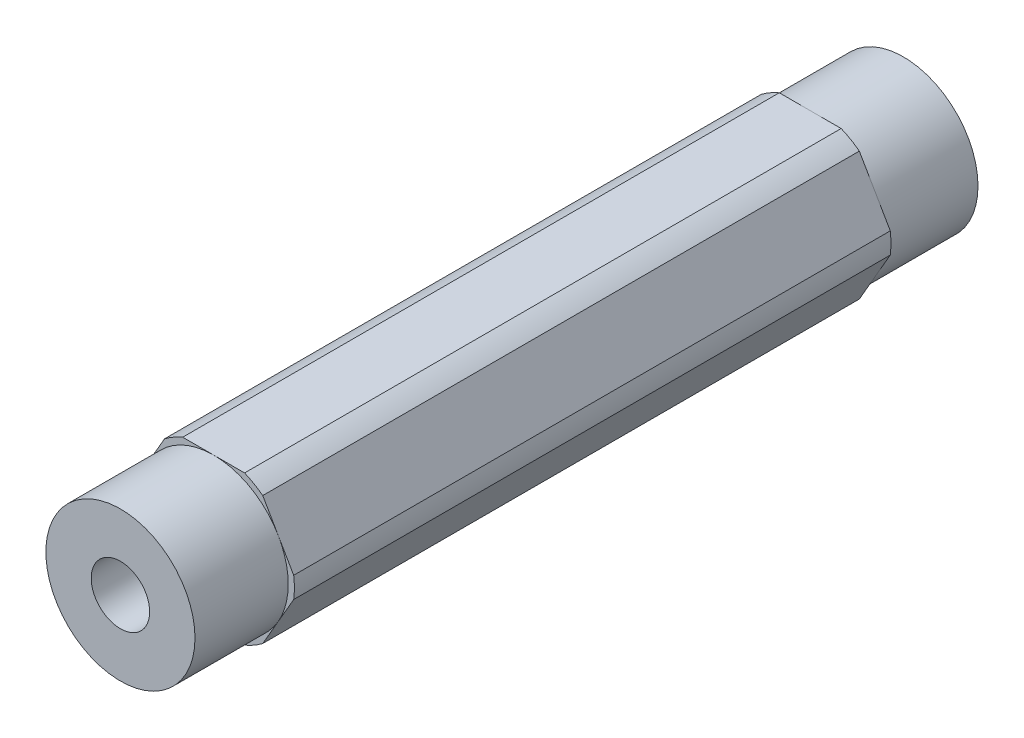
ISO-10303-21;
HEADER;
FILE_DESCRIPTION(('STEP AP214'),'2;1');
FILE_NAME('part.step','',(''),(''),'','','');
FILE_SCHEMA(('AUTOMOTIVE_DESIGN { 1 0 10303 214 1 1 1 1 }'));
ENDSEC;
DATA;
#1=APPLICATION_CONTEXT('core data for automotive mechanical design processes');
#2=APPLICATION_PROTOCOL_DEFINITION('international standard','automotive_design',2000,#1);
#3=PRODUCT_CONTEXT('',#1,'mechanical');
#4=PRODUCT('Part','Part','',(#3));
#5=PRODUCT_RELATED_PRODUCT_CATEGORY('part','',(#4));
#6=PRODUCT_DEFINITION_FORMATION('','',#4);
#7=PRODUCT_DEFINITION_CONTEXT('part definition',#1,'design');
#8=PRODUCT_DEFINITION('design','',#6,#7);
#9=PRODUCT_DEFINITION_SHAPE('','',#8);
#10=(LENGTH_UNIT() NAMED_UNIT(*) SI_UNIT(.MILLI.,.METRE.));
#11=(NAMED_UNIT(*) PLANE_ANGLE_UNIT() SI_UNIT($,.RADIAN.));
#12=(NAMED_UNIT(*) SI_UNIT($,.STERADIAN.) SOLID_ANGLE_UNIT());
#13=UNCERTAINTY_MEASURE_WITH_UNIT(LENGTH_MEASURE(1.E-05),#10,'distance_accuracy_value','');
#14=(GEOMETRIC_REPRESENTATION_CONTEXT(3) GLOBAL_UNCERTAINTY_ASSIGNED_CONTEXT((#13)) GLOBAL_UNIT_ASSIGNED_CONTEXT((#10,
#11,#12)) REPRESENTATION_CONTEXT('',''));
#15=CARTESIAN_POINT('',(0.,0.,0.));
#16=DIRECTION('',(0.,0.,1.));
#17=DIRECTION('',(1.,0.,0.));
#18=AXIS2_PLACEMENT_3D('',#15,#16,#17);
#19=CARTESIAN_POINT('',(-5.49926131403119,3.175,33.3375));
#20=DIRECTION('',(0.866025403784439,-0.5,0.));
#21=DIRECTION('',(0.5,0.866025403784439,0.));
#22=AXIS2_PLACEMENT_3D('',#19,#20,#21);
#23=PLANE('',#22);
#24=DIRECTION('',(-0.5,-0.866025403784439,0.));
#25=VECTOR('',#24,1.);
#26=CARTESIAN_POINT('',(-5.49926131403119,3.175,-25.4));
#27=LINE('',#26,#25);
#28=CARTESIAN_POINT('',(-5.49926131403119,3.175,-25.4));
#29=VERTEX_POINT('',#28);
#30=CARTESIAN_POINT('',(-6.81675178197583,0.893039571032184,-25.4));
#31=VERTEX_POINT('',#30);
#32=EDGE_CURVE('E233',#29,#31,#27,.T.);
#33=ORIENTED_EDGE('',*,*,#32,.T.);
#34=DIRECTION('',(0.,0.,-1.));
#35=VECTOR('',#34,1.);
#36=CARTESIAN_POINT('',(-6.81675178197583,0.893039571032184,33.3375));
#37=LINE('',#36,#35);
#38=CARTESIAN_POINT('',(-6.81675178197583,0.893039571032184,25.4));
#39=VERTEX_POINT('',#38);
#40=EDGE_CURVE('E426',#39,#31,#37,.T.);
#41=ORIENTED_EDGE('',*,*,#40,.F.);
#42=DIRECTION('',(-0.5,-0.866025403784439,0.));
#43=VECTOR('',#42,1.);
#44=CARTESIAN_POINT('',(-5.49926131403119,3.175,25.4));
#45=LINE('',#44,#43);
#46=CARTESIAN_POINT('',(-5.49926131403119,3.175,25.4));
#47=VERTEX_POINT('',#46);
#48=EDGE_CURVE('E316',#47,#39,#45,.T.);
#49=ORIENTED_EDGE('',*,*,#48,.F.);
#50=DIRECTION('',(-0.5,-0.866025403784439,0.));
#51=VECTOR('',#50,1.);
#52=CARTESIAN_POINT('',(-5.49926131403119,3.175,25.4));
#53=LINE('',#52,#51);
#54=CARTESIAN_POINT('',(-4.18177084608654,5.45696042896782,25.4));
#55=VERTEX_POINT('',#54);
#56=EDGE_CURVE('E379',#55,#47,#53,.T.);
#57=ORIENTED_EDGE('',*,*,#56,.F.);
#58=DIRECTION('',(0.,0.,-1.));
#59=VECTOR('',#58,1.);
#60=CARTESIAN_POINT('',(-4.18177084608654,5.45696042896782,33.3375));
#61=LINE('',#60,#59);
#62=CARTESIAN_POINT('',(-4.18177084608654,5.45696042896782,-25.4));
#63=VERTEX_POINT('',#62);
#64=EDGE_CURVE('E430',#55,#63,#61,.T.);
#65=ORIENTED_EDGE('',*,*,#64,.T.);
#66=DIRECTION('',(-0.5,-0.866025403784439,0.));
#67=VECTOR('',#66,1.);
#68=CARTESIAN_POINT('',(-5.49926131403119,3.175,-25.4));
#69=LINE('',#68,#67);
#70=EDGE_CURVE('E286',#63,#29,#69,.T.);
#71=ORIENTED_EDGE('',*,*,#70,.T.);
#72=EDGE_LOOP('',(#33,#41,#49,#57,#65,#71));
#73=FACE_BOUND('',#72,.T.);
#74=ADVANCED_FACE('F95',(#73),#23,.F.);
#75=CARTESIAN_POINT('',(0.,0.,33.3375));
#76=DIRECTION('',(0.,0.,-1.));
#77=DIRECTION('',(-1.,0.,0.));
#78=AXIS2_PLACEMENT_3D('',#75,#76,#77);
#79=CYLINDRICAL_SURFACE('',#78,6.874999966);
#80=CARTESIAN_POINT('',(0.,0.,-25.4));
#81=DIRECTION('',(0.,0.,1.));
#82=DIRECTION('',(1.,0.,0.));
#83=AXIS2_PLACEMENT_3D('',#80,#81,#82);
#84=CIRCLE('',#83,6.874999966);
#85=CARTESIAN_POINT('',(-6.81675178197583,-0.893039571032178,-25.4));
#86=VERTEX_POINT('',#85);
#87=EDGE_CURVE('E252',#31,#86,#84,.T.);
#88=ORIENTED_EDGE('',*,*,#87,.T.);
#89=DIRECTION('',(0.,0.,-1.));
#90=VECTOR('',#89,1.);
#91=CARTESIAN_POINT('',(-6.81675178197583,-0.893039571032178,33.3375));
#92=LINE('',#91,#90);
#93=CARTESIAN_POINT('',(-6.81675178197583,-0.893039571032178,25.4));
#94=VERTEX_POINT('',#93);
#95=EDGE_CURVE('E250',#94,#86,#92,.T.);
#96=ORIENTED_EDGE('',*,*,#95,.F.);
#97=CARTESIAN_POINT('',(0.,0.,25.4));
#98=DIRECTION('',(0.,0.,1.));
#99=DIRECTION('',(1.,0.,0.));
#100=AXIS2_PLACEMENT_3D('',#97,#98,#99);
#101=CIRCLE('',#100,6.874999966);
#102=EDGE_CURVE('E319',#39,#94,#101,.T.);
#103=ORIENTED_EDGE('',*,*,#102,.F.);
#104=ORIENTED_EDGE('',*,*,#40,.T.);
#105=EDGE_LOOP('',(#88,#96,#103,#104));
#106=FACE_BOUND('',#105,.T.);
#107=ADVANCED_FACE('F482',(#106),#79,.T.);
#108=CARTESIAN_POINT('',(-5.49926131403118,-3.175,33.3375));
#109=DIRECTION('',(0.866025403784438,0.5,0.));
#110=DIRECTION('',(-0.5,0.866025403784438,0.));
#111=AXIS2_PLACEMENT_3D('',#108,#109,#110);
#112=PLANE('',#111);
#113=DIRECTION('',(0.5,-0.866025403784438,0.));
#114=VECTOR('',#113,1.);
#115=CARTESIAN_POINT('',(-5.49926131403118,-3.175,-25.4));
#116=LINE('',#115,#114);
#117=CARTESIAN_POINT('',(-5.49926131403118,-3.175,-25.4));
#118=VERTEX_POINT('',#117);
#119=EDGE_CURVE('E230',#86,#118,#116,.T.);
#120=ORIENTED_EDGE('',*,*,#119,.T.);
#121=DIRECTION('',(0.5,-0.866025403784438,0.));
#122=VECTOR('',#121,1.);
#123=CARTESIAN_POINT('',(-5.49926131403118,-3.175,-25.4));
#124=LINE('',#123,#122);
#125=CARTESIAN_POINT('',(-4.18177084608654,-5.45696042896782,-25.4));
#126=VERTEX_POINT('',#125);
#127=EDGE_CURVE('E246',#118,#126,#124,.T.);
#128=ORIENTED_EDGE('',*,*,#127,.T.);
#129=DIRECTION('',(0.,0.,-1.));
#130=VECTOR('',#129,1.);
#131=CARTESIAN_POINT('',(-4.18177084608654,-5.45696042896783,33.3375));
#132=LINE('',#131,#130);
#133=CARTESIAN_POINT('',(-4.18177084608654,-5.45696042896782,25.4));
#134=VERTEX_POINT('',#133);
#135=EDGE_CURVE('E421',#134,#126,#132,.T.);
#136=ORIENTED_EDGE('',*,*,#135,.F.);
#137=DIRECTION('',(0.5,-0.866025403784438,0.));
#138=VECTOR('',#137,1.);
#139=CARTESIAN_POINT('',(-5.49926131403118,-3.175,25.4));
#140=LINE('',#139,#138);
#141=CARTESIAN_POINT('',(-5.49926131403118,-3.175,25.4));
#142=VERTEX_POINT('',#141);
#143=EDGE_CURVE('E357',#142,#134,#140,.T.);
#144=ORIENTED_EDGE('',*,*,#143,.F.);
#145=DIRECTION('',(0.5,-0.866025403784438,0.));
#146=VECTOR('',#145,1.);
#147=CARTESIAN_POINT('',(-5.49926131403118,-3.175,25.4));
#148=LINE('',#147,#146);
#149=EDGE_CURVE('E322',#94,#142,#148,.T.);
#150=ORIENTED_EDGE('',*,*,#149,.F.);
#151=ORIENTED_EDGE('',*,*,#95,.T.);
#152=EDGE_LOOP('',(#120,#128,#136,#144,#150,#151));
#153=FACE_BOUND('',#152,.T.);
#154=ADVANCED_FACE('F244',(#153),#112,.F.);
#155=CARTESIAN_POINT('',(0.,-6.35,33.3375));
#156=DIRECTION('',(0.,1.,0.));
#157=DIRECTION('',(-1.,0.,0.));
#158=AXIS2_PLACEMENT_3D('',#155,#156,#157);
#159=PLANE('',#158);
#160=DIRECTION('',(1.,0.,0.));
#161=VECTOR('',#160,1.);
#162=CARTESIAN_POINT('',(0.,-6.35,-25.4));
#163=LINE('',#162,#161);
#164=CARTESIAN_POINT('',(0.,-6.35,-25.4));
#165=VERTEX_POINT('',#164);
#166=CARTESIAN_POINT('',(2.63498093588929,-6.35,-25.4));
#167=VERTEX_POINT('',#166);
#168=EDGE_CURVE('E464',#165,#167,#163,.T.);
#169=ORIENTED_EDGE('',*,*,#168,.T.);
#170=DIRECTION('',(0.,0.,-1.));
#171=VECTOR('',#170,1.);
#172=CARTESIAN_POINT('',(2.63498093588929,-6.35,33.3375));
#173=LINE('',#172,#171);
#174=CARTESIAN_POINT('',(2.63498093588929,-6.35,25.4));
#175=VERTEX_POINT('',#174);
#176=EDGE_CURVE('E413',#175,#167,#173,.T.);
#177=ORIENTED_EDGE('',*,*,#176,.F.);
#178=DIRECTION('',(1.,0.,0.));
#179=VECTOR('',#178,1.);
#180=CARTESIAN_POINT('',(0.,-6.35,25.4));
#181=LINE('',#180,#179);
#182=CARTESIAN_POINT('',(0.,-6.35,25.4));
#183=VERTEX_POINT('',#182);
#184=EDGE_CURVE('E329',#183,#175,#181,.T.);
#185=ORIENTED_EDGE('',*,*,#184,.F.);
#186=DIRECTION('',(1.,0.,0.));
#187=VECTOR('',#186,1.);
#188=CARTESIAN_POINT('',(0.,-6.35,25.4));
#189=LINE('',#188,#187);
#190=CARTESIAN_POINT('',(-2.63498093588928,-6.35,25.4));
#191=VERTEX_POINT('',#190);
#192=EDGE_CURVE('E362',#191,#183,#189,.T.);
#193=ORIENTED_EDGE('',*,*,#192,.F.);
#194=DIRECTION('',(0.,0.,-1.));
#195=VECTOR('',#194,1.);
#196=CARTESIAN_POINT('',(-2.63498093588928,-6.35,33.3375));
#197=LINE('',#196,#195);
#198=CARTESIAN_POINT('',(-2.63498093588928,-6.35,-25.4));
#199=VERTEX_POINT('',#198);
#200=EDGE_CURVE('E417',#191,#199,#197,.T.);
#201=ORIENTED_EDGE('',*,*,#200,.T.);
#202=DIRECTION('',(1.,0.,0.));
#203=VECTOR('',#202,1.);
#204=CARTESIAN_POINT('',(0.,-6.35,-25.4));
#205=LINE('',#204,#203);
#206=EDGE_CURVE('E269',#199,#165,#205,.T.);
#207=ORIENTED_EDGE('',*,*,#206,.T.);
#208=EDGE_LOOP('',(#169,#177,#185,#193,#201,#207));
#209=FACE_BOUND('',#208,.T.);
#210=ADVANCED_FACE('F517',(#209),#159,.F.);
#211=CARTESIAN_POINT('',(0.,0.,-25.4));
#212=DIRECTION('',(0.,0.,1.));
#213=DIRECTION('',(1.,0.,0.));
#214=AXIS2_PLACEMENT_3D('',#211,#212,#213);
#215=CIRCLE('',#214,6.874999966);
#216=CARTESIAN_POINT('',(4.18177084608655,-5.45696042896782,-25.4));
#217=VERTEX_POINT('',#216);
#218=EDGE_CURVE('E468',#167,#217,#215,.T.);
#219=ORIENTED_EDGE('',*,*,#218,.T.);
#220=DIRECTION('',(0.,0.,-1.));
#221=VECTOR('',#220,1.);
#222=CARTESIAN_POINT('',(4.18177084608655,-5.45696042896782,33.3375));
#223=LINE('',#222,#221);
#224=CARTESIAN_POINT('',(4.18177084608655,-5.45696042896782,25.4));
#225=VERTEX_POINT('',#224);
#226=EDGE_CURVE('E409',#225,#217,#223,.T.);
#227=ORIENTED_EDGE('',*,*,#226,.F.);
#228=CARTESIAN_POINT('',(0.,0.,25.4));
#229=DIRECTION('',(0.,0.,1.));
#230=DIRECTION('',(1.,0.,0.));
#231=AXIS2_PLACEMENT_3D('',#228,#229,#230);
#232=CIRCLE('',#231,6.874999966);
#233=EDGE_CURVE('E332',#175,#225,#232,.T.);
#234=ORIENTED_EDGE('',*,*,#233,.F.);
#235=ORIENTED_EDGE('',*,*,#176,.T.);
#236=EDGE_LOOP('',(#219,#227,#234,#235));
#237=FACE_BOUND('',#236,.T.);
#238=ADVANCED_FACE('F512',(#237),#79,.T.);
#239=CARTESIAN_POINT('',(5.49926131403119,-3.175,33.3375));
#240=DIRECTION('',(-0.866025403784439,0.5,0.));
#241=DIRECTION('',(-0.5,-0.866025403784439,0.));
#242=AXIS2_PLACEMENT_3D('',#239,#240,#241);
#243=PLANE('',#242);
#244=DIRECTION('',(0.5,0.866025403784439,0.));
#245=VECTOR('',#244,1.);
#246=CARTESIAN_POINT('',(5.49926131403119,-3.175,-25.4));
#247=LINE('',#246,#245);
#248=CARTESIAN_POINT('',(5.49926131403119,-3.175,-25.4));
#249=VERTEX_POINT('',#248);
#250=EDGE_CURVE('E472',#217,#249,#247,.T.);
#251=ORIENTED_EDGE('',*,*,#250,.T.);
#252=DIRECTION('',(0.5,0.866025403784439,0.));
#253=VECTOR('',#252,1.);
#254=CARTESIAN_POINT('',(5.49926131403119,-3.175,-25.4));
#255=LINE('',#254,#253);
#256=CARTESIAN_POINT('',(6.81675178197583,-0.893039571032179,-25.4));
#257=VERTEX_POINT('',#256);
#258=EDGE_CURVE('E287',#249,#257,#255,.T.);
#259=ORIENTED_EDGE('',*,*,#258,.T.);
#260=DIRECTION('',(0.,0.,-1.));
#261=VECTOR('',#260,1.);
#262=CARTESIAN_POINT('',(6.81675178197583,-0.89303957103218,33.3375));
#263=LINE('',#262,#261);
#264=CARTESIAN_POINT('',(6.81675178197583,-0.893039571032179,25.4));
#265=VERTEX_POINT('',#264);
#266=EDGE_CURVE('E405',#265,#257,#263,.T.);
#267=ORIENTED_EDGE('',*,*,#266,.F.);
#268=DIRECTION('',(0.5,0.866025403784439,0.));
#269=VECTOR('',#268,1.);
#270=CARTESIAN_POINT('',(5.49926131403119,-3.175,25.4));
#271=LINE('',#270,#269);
#272=CARTESIAN_POINT('',(5.49926131403119,-3.175,25.4));
#273=VERTEX_POINT('',#272);
#274=EDGE_CURVE('E124',#273,#265,#271,.T.);
#275=ORIENTED_EDGE('',*,*,#274,.F.);
#276=DIRECTION('',(0.5,0.866025403784439,0.));
#277=VECTOR('',#276,1.);
#278=CARTESIAN_POINT('',(5.49926131403119,-3.175,25.4));
#279=LINE('',#278,#277);
#280=EDGE_CURVE('E335',#225,#273,#279,.T.);
#281=ORIENTED_EDGE('',*,*,#280,.F.);
#282=ORIENTED_EDGE('',*,*,#226,.T.);
#283=EDGE_LOOP('',(#251,#259,#267,#275,#281,#282));
#284=FACE_BOUND('',#283,.T.);
#285=ADVANCED_FACE('F506',(#284),#243,.F.);
#286=CARTESIAN_POINT('',(5.49926131403118,3.175,33.3375));
#287=DIRECTION('',(-0.866025403784439,-0.5,0.));
#288=DIRECTION('',(0.5,-0.866025403784439,0.));
#289=AXIS2_PLACEMENT_3D('',#286,#287,#288);
#290=PLANE('',#289);
#291=DIRECTION('',(-0.5,0.866025403784439,0.));
#292=VECTOR('',#291,1.);
#293=CARTESIAN_POINT('',(5.49926131403119,3.175,-25.4));
#294=LINE('',#293,#292);
#295=CARTESIAN_POINT('',(5.49926131403119,3.175,-25.4));
#296=VERTEX_POINT('',#295);
#297=CARTESIAN_POINT('',(4.18177084608654,5.45696042896782,-25.4));
#298=VERTEX_POINT('',#297);
#299=EDGE_CURVE('E276',#296,#298,#294,.T.);
#300=ORIENTED_EDGE('',*,*,#299,.T.);
#301=DIRECTION('',(0.,0.,-1.));
#302=VECTOR('',#301,1.);
#303=CARTESIAN_POINT('',(4.18177084608654,5.45696042896782,33.3375));
#304=LINE('',#303,#302);
#305=CARTESIAN_POINT('',(4.18177084608654,5.45696042896782,25.4));
#306=VERTEX_POINT('',#305);
#307=EDGE_CURVE('E12',#306,#298,#304,.T.);
#308=ORIENTED_EDGE('',*,*,#307,.F.);
#309=DIRECTION('',(-0.5,0.866025403784439,0.));
#310=VECTOR('',#309,1.);
#311=CARTESIAN_POINT('',(5.49926131403119,3.175,25.4));
#312=LINE('',#311,#310);
#313=CARTESIAN_POINT('',(5.49926131403119,3.175,25.4));
#314=VERTEX_POINT('',#313);
#315=EDGE_CURVE('E342',#314,#306,#312,.T.);
#316=ORIENTED_EDGE('',*,*,#315,.F.);
#317=DIRECTION('',(-0.5,0.866025403784439,0.));
#318=VECTOR('',#317,1.);
#319=CARTESIAN_POINT('',(5.49926131403119,3.175,25.4));
#320=LINE('',#319,#318);
#321=CARTESIAN_POINT('',(6.81675178197583,0.893039571032178,25.4));
#322=VERTEX_POINT('',#321);
#323=EDGE_CURVE('E374',#322,#314,#320,.T.);
#324=ORIENTED_EDGE('',*,*,#323,.F.);
#325=DIRECTION('',(0.,0.,-1.));
#326=VECTOR('',#325,1.);
#327=CARTESIAN_POINT('',(6.81675178197583,0.89303957103218,33.3375));
#328=LINE('',#327,#326);
#329=CARTESIAN_POINT('',(6.81675178197583,0.893039571032178,-25.4));
#330=VERTEX_POINT('',#329);
#331=EDGE_CURVE('E398',#322,#330,#328,.T.);
#332=ORIENTED_EDGE('',*,*,#331,.T.);
#333=DIRECTION('',(-0.5,0.866025403784439,0.));
#334=VECTOR('',#333,1.);
#335=CARTESIAN_POINT('',(5.49926131403119,3.175,-25.4));
#336=LINE('',#335,#334);
#337=EDGE_CURVE('E303',#330,#296,#336,.T.);
#338=ORIENTED_EDGE('',*,*,#337,.T.);
#339=EDGE_LOOP('',(#300,#308,#316,#324,#332,#338));
#340=FACE_BOUND('',#339,.T.);
#341=ADVANCED_FACE('F498',(#340),#290,.F.);
#342=CARTESIAN_POINT('',(0.,0.,-25.4));
#343=DIRECTION('',(0.,0.,1.));
#344=DIRECTION('',(1.,0.,0.));
#345=AXIS2_PLACEMENT_3D('',#342,#343,#344);
#346=CIRCLE('',#345,6.874999966);
#347=CARTESIAN_POINT('',(2.63498093588929,6.35,-25.4));
#348=VERTEX_POINT('',#347);
#349=EDGE_CURVE('E452',#298,#348,#346,.T.);
#350=ORIENTED_EDGE('',*,*,#349,.T.);
#351=DIRECTION('',(0.,0.,-1.));
#352=VECTOR('',#351,1.);
#353=CARTESIAN_POINT('',(2.63498093588929,6.35,33.3375));
#354=LINE('',#353,#352);
#355=CARTESIAN_POINT('',(2.63498093588929,6.35,25.4));
#356=VERTEX_POINT('',#355);
#357=EDGE_CURVE('E105',#356,#348,#354,.T.);
#358=ORIENTED_EDGE('',*,*,#357,.F.);
#359=CARTESIAN_POINT('',(0.,0.,25.4));
#360=DIRECTION('',(0.,0.,1.));
#361=DIRECTION('',(1.,0.,0.));
#362=AXIS2_PLACEMENT_3D('',#359,#360,#361);
#363=CIRCLE('',#362,6.874999966);
#364=EDGE_CURVE('E345',#306,#356,#363,.T.);
#365=ORIENTED_EDGE('',*,*,#364,.F.);
#366=ORIENTED_EDGE('',*,*,#307,.T.);
#367=EDGE_LOOP('',(#350,#358,#365,#366));
#368=FACE_BOUND('',#367,.T.);
#369=ADVANCED_FACE('F450',(#368),#79,.T.);
#370=CARTESIAN_POINT('',(0.,6.35,33.3375));
#371=DIRECTION('',(0.,-1.,0.));
#372=DIRECTION('',(1.,0.,0.));
#373=AXIS2_PLACEMENT_3D('',#370,#371,#372);
#374=PLANE('',#373);
#375=DIRECTION('',(-1.,0.,0.));
#376=VECTOR('',#375,1.);
#377=CARTESIAN_POINT('',(0.,6.35,-25.4));
#378=LINE('',#377,#376);
#379=CARTESIAN_POINT('',(0.,6.35,-25.4));
#380=VERTEX_POINT('',#379);
#381=EDGE_CURVE('E444',#348,#380,#378,.T.);
#382=ORIENTED_EDGE('',*,*,#381,.T.);
#383=DIRECTION('',(-1.,0.,0.));
#384=VECTOR('',#383,1.);
#385=CARTESIAN_POINT('',(0.,6.35,-25.4));
#386=LINE('',#385,#384);
#387=CARTESIAN_POINT('',(-2.63498093588929,6.35,-25.4));
#388=VERTEX_POINT('',#387);
#389=EDGE_CURVE('E295',#380,#388,#386,.T.);
#390=ORIENTED_EDGE('',*,*,#389,.T.);
#391=DIRECTION('',(0.,0.,-1.));
#392=VECTOR('',#391,1.);
#393=CARTESIAN_POINT('',(-2.63498093588929,6.35,33.3375));
#394=LINE('',#393,#392);
#395=CARTESIAN_POINT('',(-2.63498093588929,6.35,25.4));
#396=VERTEX_POINT('',#395);
#397=EDGE_CURVE('E434',#396,#388,#394,.T.);
#398=ORIENTED_EDGE('',*,*,#397,.F.);
#399=DIRECTION('',(-1.,0.,0.));
#400=VECTOR('',#399,1.);
#401=CARTESIAN_POINT('',(0.,6.35,25.4));
#402=LINE('',#401,#400);
#403=CARTESIAN_POINT('',(0.,6.35,25.4));
#404=VERTEX_POINT('',#403);
#405=EDGE_CURVE('E373',#404,#396,#402,.T.);
#406=ORIENTED_EDGE('',*,*,#405,.F.);
#407=DIRECTION('',(-1.,0.,0.));
#408=VECTOR('',#407,1.);
#409=CARTESIAN_POINT('',(0.,6.35,25.4));
#410=LINE('',#409,#408);
#411=EDGE_CURVE('E348',#356,#404,#410,.T.);
#412=ORIENTED_EDGE('',*,*,#411,.F.);
#413=ORIENTED_EDGE('',*,*,#357,.T.);
#414=EDGE_LOOP('',(#382,#390,#398,#406,#412,#413));
#415=FACE_BOUND('',#414,.T.);
#416=ADVANCED_FACE('F443',(#415),#374,.F.);
#417=CARTESIAN_POINT('',(0.,0.,-25.4));
#418=DIRECTION('',(0.,0.,1.));
#419=DIRECTION('',(1.,0.,0.));
#420=AXIS2_PLACEMENT_3D('',#417,#418,#419);
#421=CIRCLE('',#420,6.874999966);
#422=EDGE_CURVE('E291',#388,#63,#421,.T.);
#423=ORIENTED_EDGE('',*,*,#422,.T.);
#424=ORIENTED_EDGE('',*,*,#64,.F.);
#425=CARTESIAN_POINT('',(0.,0.,25.4));
#426=DIRECTION('',(0.,0.,1.));
#427=DIRECTION('',(1.,0.,0.));
#428=AXIS2_PLACEMENT_3D('',#425,#426,#427);
#429=CIRCLE('',#428,6.874999966);
#430=EDGE_CURVE('E113',#396,#55,#429,.T.);
#431=ORIENTED_EDGE('',*,*,#430,.F.);
#432=ORIENTED_EDGE('',*,*,#397,.T.);
#433=EDGE_LOOP('',(#423,#424,#431,#432));
#434=FACE_BOUND('',#433,.T.);
#435=ADVANCED_FACE('F491',(#434),#79,.T.);
#436=CARTESIAN_POINT('',(0.,0.,-25.4));
#437=DIRECTION('',(0.,0.,1.));
#438=DIRECTION('',(1.,0.,0.));
#439=AXIS2_PLACEMENT_3D('',#436,#437,#438);
#440=CIRCLE('',#439,6.874999966);
#441=EDGE_CURVE('E260',#126,#199,#440,.T.);
#442=ORIENTED_EDGE('',*,*,#441,.T.);
#443=ORIENTED_EDGE('',*,*,#200,.F.);
#444=CARTESIAN_POINT('',(0.,0.,25.4));
#445=DIRECTION('',(0.,0.,1.));
#446=DIRECTION('',(1.,0.,0.));
#447=AXIS2_PLACEMENT_3D('',#444,#445,#446);
#448=CIRCLE('',#447,6.874999966);
#449=EDGE_CURVE('E132',#134,#191,#448,.T.);
#450=ORIENTED_EDGE('',*,*,#449,.F.);
#451=ORIENTED_EDGE('',*,*,#135,.T.);
#452=EDGE_LOOP('',(#442,#443,#450,#451));
#453=FACE_BOUND('',#452,.T.);
#454=ADVANCED_FACE('F520',(#453),#79,.T.);
#455=CARTESIAN_POINT('',(0.,0.,-25.4));
#456=DIRECTION('',(0.,0.,1.));
#457=DIRECTION('',(1.,0.,0.));
#458=AXIS2_PLACEMENT_3D('',#455,#456,#457);
#459=CIRCLE('',#458,6.874999966);
#460=EDGE_CURVE('E307',#257,#330,#459,.T.);
#461=ORIENTED_EDGE('',*,*,#460,.T.);
#462=ORIENTED_EDGE('',*,*,#331,.F.);
#463=CARTESIAN_POINT('',(0.,0.,25.4));
#464=DIRECTION('',(0.,0.,1.));
#465=DIRECTION('',(1.,0.,0.));
#466=AXIS2_PLACEMENT_3D('',#463,#464,#465);
#467=CIRCLE('',#466,6.874999966);
#468=EDGE_CURVE('E388',#265,#322,#467,.T.);
#469=ORIENTED_EDGE('',*,*,#468,.F.);
#470=ORIENTED_EDGE('',*,*,#266,.T.);
#471=EDGE_LOOP('',(#461,#462,#469,#470));
#472=FACE_BOUND('',#471,.T.);
#473=ADVANCED_FACE('F503',(#472),#79,.T.);
#474=CARTESIAN_POINT('',(0.,0.,33.3375));
#475=DIRECTION('',(0.,0.,1.));
#476=DIRECTION('',(1.,0.,0.));
#477=AXIS2_PLACEMENT_3D('',#474,#475,#476);
#478=PLANE('',#477);
#479=CARTESIAN_POINT('',(0.,0.,33.3375));
#480=DIRECTION('',(0.,0.,1.));
#481=DIRECTION('',(1.,0.,0.));
#482=AXIS2_PLACEMENT_3D('',#479,#480,#481);
#483=CIRCLE('',#482,2.4892);
#484=CARTESIAN_POINT('',(2.4892,0.,33.3375));
#485=VERTEX_POINT('',#484);
#486=EDGE_CURVE('E394',#485,#485,#483,.T.);
#487=ORIENTED_EDGE('',*,*,#486,.F.);
#488=EDGE_LOOP('',(#487));
#489=FACE_BOUND('',#488,.T.);
#490=CARTESIAN_POINT('',(0.,0.,33.3375));
#491=DIRECTION('',(0.,0.,1.));
#492=DIRECTION('',(1.,0.,0.));
#493=AXIS2_PLACEMENT_3D('',#490,#491,#492);
#494=CIRCLE('',#493,6.35);
#495=CARTESIAN_POINT('',(6.35,0.,33.3375));
#496=VERTEX_POINT('',#495);
#497=EDGE_CURVE('E352',#496,#496,#494,.T.);
#498=ORIENTED_EDGE('',*,*,#497,.T.);
#499=EDGE_LOOP('',(#498));
#500=FACE_BOUND('',#499,.T.);
#501=ADVANCED_FACE('F656',(#489,#500),#478,.T.);
#502=CARTESIAN_POINT('',(0.,0.,33.3375));
#503=DIRECTION('',(0.,0.,-1.));
#504=DIRECTION('',(-1.,0.,0.));
#505=AXIS2_PLACEMENT_3D('',#502,#503,#504);
#506=CYLINDRICAL_SURFACE('',#505,2.4892);
#507=ORIENTED_EDGE('',*,*,#486,.T.);
#508=EDGE_LOOP('',(#507));
#509=FACE_BOUND('',#508,.T.);
#510=CARTESIAN_POINT('',(0.,0.,-33.3375));
#511=DIRECTION('',(0.,0.,1.));
#512=DIRECTION('',(1.,0.,0.));
#513=AXIS2_PLACEMENT_3D('',#510,#511,#512);
#514=CIRCLE('',#513,2.4892);
#515=CARTESIAN_POINT('',(2.4892,0.,-33.3375));
#516=VERTEX_POINT('',#515);
#517=EDGE_CURVE('E382',#516,#516,#514,.T.);
#518=ORIENTED_EDGE('',*,*,#517,.F.);
#519=EDGE_LOOP('',(#518));
#520=FACE_BOUND('',#519,.T.);
#521=ADVANCED_FACE('F97',(#509,#520),#506,.F.);
#522=CARTESIAN_POINT('',(0.,0.,-33.3375));
#523=DIRECTION('',(0.,0.,1.));
#524=DIRECTION('',(1.,0.,0.));
#525=AXIS2_PLACEMENT_3D('',#522,#523,#524);
#526=PLANE('',#525);
#527=ORIENTED_EDGE('',*,*,#517,.T.);
#528=EDGE_LOOP('',(#527));
#529=FACE_BOUND('',#528,.T.);
#530=CARTESIAN_POINT('',(0.,0.,-33.3375));
#531=DIRECTION('',(0.,0.,1.));
#532=DIRECTION('',(1.,0.,0.));
#533=AXIS2_PLACEMENT_3D('',#530,#531,#532);
#534=CIRCLE('',#533,6.35);
#535=CARTESIAN_POINT('',(6.35,0.,-33.3375));
#536=VERTEX_POINT('',#535);
#537=EDGE_CURVE('E270',#536,#536,#534,.T.);
#538=ORIENTED_EDGE('',*,*,#537,.F.);
#539=EDGE_LOOP('',(#538));
#540=FACE_BOUND('',#539,.T.);
#541=ADVANCED_FACE('F532',(#529,#540),#526,.F.);
#542=CARTESIAN_POINT('',(0.,0.,25.4));
#543=DIRECTION('',(0.,0.,1.));
#544=DIRECTION('',(1.,0.,0.));
#545=AXIS2_PLACEMENT_3D('',#542,#543,#544);
#546=PLANE('',#545);
#547=CARTESIAN_POINT('',(0.,0.,25.4));
#548=DIRECTION('',(0.,0.,1.));
#549=DIRECTION('',(1.,0.,0.));
#550=AXIS2_PLACEMENT_3D('',#547,#548,#549);
#551=CIRCLE('',#550,6.35);
#552=EDGE_CURVE('E369',#404,#47,#551,.T.);
#553=ORIENTED_EDGE('',*,*,#552,.F.);
#554=ORIENTED_EDGE('',*,*,#405,.T.);
#555=ORIENTED_EDGE('',*,*,#430,.T.);
#556=ORIENTED_EDGE('',*,*,#56,.T.);
#557=EDGE_LOOP('',(#553,#554,#555,#556));
#558=FACE_BOUND('',#557,.T.);
#559=ADVANCED_FACE('F529',(#558),#546,.T.);
#560=CARTESIAN_POINT('',(0.,0.,25.4));
#561=DIRECTION('',(0.,0.,1.));
#562=DIRECTION('',(1.,0.,0.));
#563=AXIS2_PLACEMENT_3D('',#560,#561,#562);
#564=PLANE('',#563);
#565=CARTESIAN_POINT('',(0.,0.,25.4));
#566=DIRECTION('',(0.,0.,1.));
#567=DIRECTION('',(1.,0.,0.));
#568=AXIS2_PLACEMENT_3D('',#565,#566,#567);
#569=CIRCLE('',#568,6.35);
#570=EDGE_CURVE('E365',#273,#314,#569,.T.);
#571=ORIENTED_EDGE('',*,*,#570,.F.);
#572=ORIENTED_EDGE('',*,*,#274,.T.);
#573=ORIENTED_EDGE('',*,*,#468,.T.);
#574=ORIENTED_EDGE('',*,*,#323,.T.);
#575=EDGE_LOOP('',(#571,#572,#573,#574));
#576=FACE_BOUND('',#575,.T.);
#577=ADVANCED_FACE('F531',(#576),#564,.T.);
#578=CARTESIAN_POINT('',(0.,0.,25.4));
#579=DIRECTION('',(0.,0.,1.));
#580=DIRECTION('',(1.,0.,0.));
#581=AXIS2_PLACEMENT_3D('',#578,#579,#580);
#582=CYLINDRICAL_SURFACE('',#581,6.35);
#583=ORIENTED_EDGE('',*,*,#497,.F.);
#584=EDGE_LOOP('',(#583));
#585=FACE_BOUND('',#584,.T.);
#586=CARTESIAN_POINT('',(0.,0.,25.4));
#587=DIRECTION('',(0.,0.,1.));
#588=DIRECTION('',(1.,0.,0.));
#589=AXIS2_PLACEMENT_3D('',#586,#587,#588);
#590=CIRCLE('',#589,6.35);
#591=EDGE_CURVE('E299',#47,#142,#590,.T.);
#592=ORIENTED_EDGE('',*,*,#591,.T.);
#593=CARTESIAN_POINT('',(0.,0.,25.4));
#594=DIRECTION('',(0.,0.,1.));
#595=DIRECTION('',(1.,0.,0.));
#596=AXIS2_PLACEMENT_3D('',#593,#594,#595);
#597=CIRCLE('',#596,6.35);
#598=EDGE_CURVE('E353',#142,#183,#597,.T.);
#599=ORIENTED_EDGE('',*,*,#598,.T.);
#600=CARTESIAN_POINT('',(0.,0.,25.4));
#601=DIRECTION('',(0.,0.,1.));
#602=DIRECTION('',(1.,0.,0.));
#603=AXIS2_PLACEMENT_3D('',#600,#601,#602);
#604=CIRCLE('',#603,6.35);
#605=EDGE_CURVE('E326',#183,#273,#604,.T.);
#606=ORIENTED_EDGE('',*,*,#605,.T.);
#607=ORIENTED_EDGE('',*,*,#570,.T.);
#608=CARTESIAN_POINT('',(0.,0.,25.4));
#609=DIRECTION('',(0.,0.,1.));
#610=DIRECTION('',(1.,0.,0.));
#611=AXIS2_PLACEMENT_3D('',#608,#609,#610);
#612=CIRCLE('',#611,6.35);
#613=EDGE_CURVE('E339',#314,#404,#612,.T.);
#614=ORIENTED_EDGE('',*,*,#613,.T.);
#615=ORIENTED_EDGE('',*,*,#552,.T.);
#616=EDGE_LOOP('',(#592,#599,#606,#607,#614,#615));
#617=FACE_BOUND('',#616,.T.);
#618=ADVANCED_FACE('F525',(#585,#617),#582,.T.);
#619=CARTESIAN_POINT('',(0.,0.,25.4));
#620=DIRECTION('',(0.,0.,1.));
#621=DIRECTION('',(1.,0.,0.));
#622=AXIS2_PLACEMENT_3D('',#619,#620,#621);
#623=PLANE('',#622);
#624=ORIENTED_EDGE('',*,*,#598,.F.);
#625=ORIENTED_EDGE('',*,*,#143,.T.);
#626=ORIENTED_EDGE('',*,*,#449,.T.);
#627=ORIENTED_EDGE('',*,*,#192,.T.);
#628=EDGE_LOOP('',(#624,#625,#626,#627));
#629=FACE_BOUND('',#628,.T.);
#630=ADVANCED_FACE('F523',(#629),#623,.T.);
#631=CARTESIAN_POINT('',(0.,0.,25.4));
#632=DIRECTION('',(0.,0.,1.));
#633=DIRECTION('',(1.,0.,0.));
#634=AXIS2_PLACEMENT_3D('',#631,#632,#633);
#635=PLANE('',#634);
#636=ORIENTED_EDGE('',*,*,#613,.F.);
#637=ORIENTED_EDGE('',*,*,#315,.T.);
#638=ORIENTED_EDGE('',*,*,#364,.T.);
#639=ORIENTED_EDGE('',*,*,#411,.T.);
#640=EDGE_LOOP('',(#636,#637,#638,#639));
#641=FACE_BOUND('',#640,.T.);
#642=ADVANCED_FACE('F644',(#641),#635,.T.);
#643=CARTESIAN_POINT('',(0.,0.,25.4));
#644=DIRECTION('',(0.,0.,1.));
#645=DIRECTION('',(1.,0.,0.));
#646=AXIS2_PLACEMENT_3D('',#643,#644,#645);
#647=PLANE('',#646);
#648=ORIENTED_EDGE('',*,*,#605,.F.);
#649=ORIENTED_EDGE('',*,*,#184,.T.);
#650=ORIENTED_EDGE('',*,*,#233,.T.);
#651=ORIENTED_EDGE('',*,*,#280,.T.);
#652=EDGE_LOOP('',(#648,#649,#650,#651));
#653=FACE_BOUND('',#652,.T.);
#654=ADVANCED_FACE('F641',(#653),#647,.T.);
#655=CARTESIAN_POINT('',(0.,0.,25.4));
#656=DIRECTION('',(0.,0.,1.));
#657=DIRECTION('',(1.,0.,0.));
#658=AXIS2_PLACEMENT_3D('',#655,#656,#657);
#659=PLANE('',#658);
#660=ORIENTED_EDGE('',*,*,#591,.F.);
#661=ORIENTED_EDGE('',*,*,#48,.T.);
#662=ORIENTED_EDGE('',*,*,#102,.T.);
#663=ORIENTED_EDGE('',*,*,#149,.T.);
#664=EDGE_LOOP('',(#660,#661,#662,#663));
#665=FACE_BOUND('',#664,.T.);
#666=ADVANCED_FACE('F528',(#665),#659,.T.);
#667=CARTESIAN_POINT('',(0.,0.,-25.4));
#668=DIRECTION('',(0.,0.,-1.));
#669=DIRECTION('',(1.,0.,0.));
#670=AXIS2_PLACEMENT_3D('',#667,#668,#669);
#671=PLANE('',#670);
#672=CARTESIAN_POINT('',(0.,0.,-25.4));
#673=DIRECTION('',(0.,0.,1.));
#674=DIRECTION('',(1.,0.,0.));
#675=AXIS2_PLACEMENT_3D('',#672,#673,#674);
#676=CIRCLE('',#675,6.35);
#677=EDGE_CURVE('E283',#380,#29,#676,.T.);
#678=ORIENTED_EDGE('',*,*,#677,.T.);
#679=ORIENTED_EDGE('',*,*,#70,.F.);
#680=ORIENTED_EDGE('',*,*,#422,.F.);
#681=ORIENTED_EDGE('',*,*,#389,.F.);
#682=EDGE_LOOP('',(#678,#679,#680,#681));
#683=FACE_BOUND('',#682,.T.);
#684=ADVANCED_FACE('F489',(#683),#671,.T.);
#685=CARTESIAN_POINT('',(0.,0.,-25.4));
#686=DIRECTION('',(0.,0.,-1.));
#687=DIRECTION('',(1.,0.,0.));
#688=AXIS2_PLACEMENT_3D('',#685,#686,#687);
#689=PLANE('',#688);
#690=CARTESIAN_POINT('',(0.,0.,-25.4));
#691=DIRECTION('',(0.,0.,1.));
#692=DIRECTION('',(1.,0.,0.));
#693=AXIS2_PLACEMENT_3D('',#690,#691,#692);
#694=CIRCLE('',#693,6.35);
#695=EDGE_CURVE('E262',#249,#296,#694,.T.);
#696=ORIENTED_EDGE('',*,*,#695,.T.);
#697=ORIENTED_EDGE('',*,*,#337,.F.);
#698=ORIENTED_EDGE('',*,*,#460,.F.);
#699=ORIENTED_EDGE('',*,*,#258,.F.);
#700=EDGE_LOOP('',(#696,#697,#698,#699));
#701=FACE_BOUND('',#700,.T.);
#702=ADVANCED_FACE('F497',(#701),#689,.T.);
#703=CARTESIAN_POINT('',(0.,0.,-25.4));
#704=DIRECTION('',(0.,0.,-1.));
#705=DIRECTION('',(-1.,0.,0.));
#706=AXIS2_PLACEMENT_3D('',#703,#704,#705);
#707=CYLINDRICAL_SURFACE('',#706,6.35);
#708=ORIENTED_EDGE('',*,*,#537,.T.);
#709=EDGE_LOOP('',(#708));
#710=FACE_BOUND('',#709,.T.);
#711=CARTESIAN_POINT('',(0.,0.,-25.4));
#712=DIRECTION('',(0.,0.,1.));
#713=DIRECTION('',(1.,0.,0.));
#714=AXIS2_PLACEMENT_3D('',#711,#712,#713);
#715=CIRCLE('',#714,6.35);
#716=EDGE_CURVE('E227',#29,#118,#715,.T.);
#717=ORIENTED_EDGE('',*,*,#716,.F.);
#718=ORIENTED_EDGE('',*,*,#677,.F.);
#719=CARTESIAN_POINT('',(0.,0.,-25.4));
#720=DIRECTION('',(0.,0.,1.));
#721=DIRECTION('',(1.,0.,0.));
#722=AXIS2_PLACEMENT_3D('',#719,#720,#721);
#723=CIRCLE('',#722,6.35);
#724=EDGE_CURVE('E459',#296,#380,#723,.T.);
#725=ORIENTED_EDGE('',*,*,#724,.F.);
#726=ORIENTED_EDGE('',*,*,#695,.F.);
#727=CARTESIAN_POINT('',(0.,0.,-25.4));
#728=DIRECTION('',(0.,0.,1.));
#729=DIRECTION('',(1.,0.,0.));
#730=AXIS2_PLACEMENT_3D('',#727,#728,#729);
#731=CIRCLE('',#730,6.35);
#732=EDGE_CURVE('E266',#165,#249,#731,.T.);
#733=ORIENTED_EDGE('',*,*,#732,.F.);
#734=CARTESIAN_POINT('',(0.,0.,-25.4));
#735=DIRECTION('',(0.,0.,1.));
#736=DIRECTION('',(1.,0.,0.));
#737=AXIS2_PLACEMENT_3D('',#734,#735,#736);
#738=CIRCLE('',#737,6.35);
#739=EDGE_CURVE('E257',#118,#165,#738,.T.);
#740=ORIENTED_EDGE('',*,*,#739,.F.);
#741=EDGE_LOOP('',(#717,#718,#725,#726,#733,#740));
#742=FACE_BOUND('',#741,.T.);
#743=ADVANCED_FACE('F264',(#710,#742),#707,.T.);
#744=CARTESIAN_POINT('',(0.,0.,-25.4));
#745=DIRECTION('',(0.,0.,-1.));
#746=DIRECTION('',(1.,0.,0.));
#747=AXIS2_PLACEMENT_3D('',#744,#745,#746);
#748=PLANE('',#747);
#749=ORIENTED_EDGE('',*,*,#739,.T.);
#750=ORIENTED_EDGE('',*,*,#206,.F.);
#751=ORIENTED_EDGE('',*,*,#441,.F.);
#752=ORIENTED_EDGE('',*,*,#127,.F.);
#753=EDGE_LOOP('',(#749,#750,#751,#752));
#754=FACE_BOUND('',#753,.T.);
#755=ADVANCED_FACE('F256',(#754),#748,.T.);
#756=CARTESIAN_POINT('',(0.,0.,-25.4));
#757=DIRECTION('',(0.,0.,-1.));
#758=DIRECTION('',(1.,0.,0.));
#759=AXIS2_PLACEMENT_3D('',#756,#757,#758);
#760=PLANE('',#759);
#761=ORIENTED_EDGE('',*,*,#724,.T.);
#762=ORIENTED_EDGE('',*,*,#381,.F.);
#763=ORIENTED_EDGE('',*,*,#349,.F.);
#764=ORIENTED_EDGE('',*,*,#299,.F.);
#765=EDGE_LOOP('',(#761,#762,#763,#764));
#766=FACE_BOUND('',#765,.T.);
#767=ADVANCED_FACE('F493',(#766),#760,.T.);
#768=CARTESIAN_POINT('',(0.,0.,-25.4));
#769=DIRECTION('',(0.,0.,-1.));
#770=DIRECTION('',(1.,0.,0.));
#771=AXIS2_PLACEMENT_3D('',#768,#769,#770);
#772=PLANE('',#771);
#773=ORIENTED_EDGE('',*,*,#732,.T.);
#774=ORIENTED_EDGE('',*,*,#250,.F.);
#775=ORIENTED_EDGE('',*,*,#218,.F.);
#776=ORIENTED_EDGE('',*,*,#168,.F.);
#777=EDGE_LOOP('',(#773,#774,#775,#776));
#778=FACE_BOUND('',#777,.T.);
#779=ADVANCED_FACE('F510',(#778),#772,.T.);
#780=CARTESIAN_POINT('',(0.,0.,-25.4));
#781=DIRECTION('',(0.,0.,-1.));
#782=DIRECTION('',(1.,0.,0.));
#783=AXIS2_PLACEMENT_3D('',#780,#781,#782);
#784=PLANE('',#783);
#785=ORIENTED_EDGE('',*,*,#716,.T.);
#786=ORIENTED_EDGE('',*,*,#119,.F.);
#787=ORIENTED_EDGE('',*,*,#87,.F.);
#788=ORIENTED_EDGE('',*,*,#32,.F.);
#789=EDGE_LOOP('',(#785,#786,#787,#788));
#790=FACE_BOUND('',#789,.T.);
#791=ADVANCED_FACE('F229',(#790),#784,.T.);
#792=CLOSED_SHELL('',(#74,#107,#154,#210,#238,#285,#341,#369,#416,#435,#454,#473,#501,#521,#541,
#559,#577,#618,#630,#642,#654,#666,#684,#702,#743,#755,#767,#779,#791));
#793=MANIFOLD_SOLID_BREP('B2',#792);
#794=ADVANCED_BREP_SHAPE_REPRESENTATION('',(#18,#793),#14);
#795=SHAPE_DEFINITION_REPRESENTATION(#9,#794);
ENDSEC;
END-ISO-10303-21;
